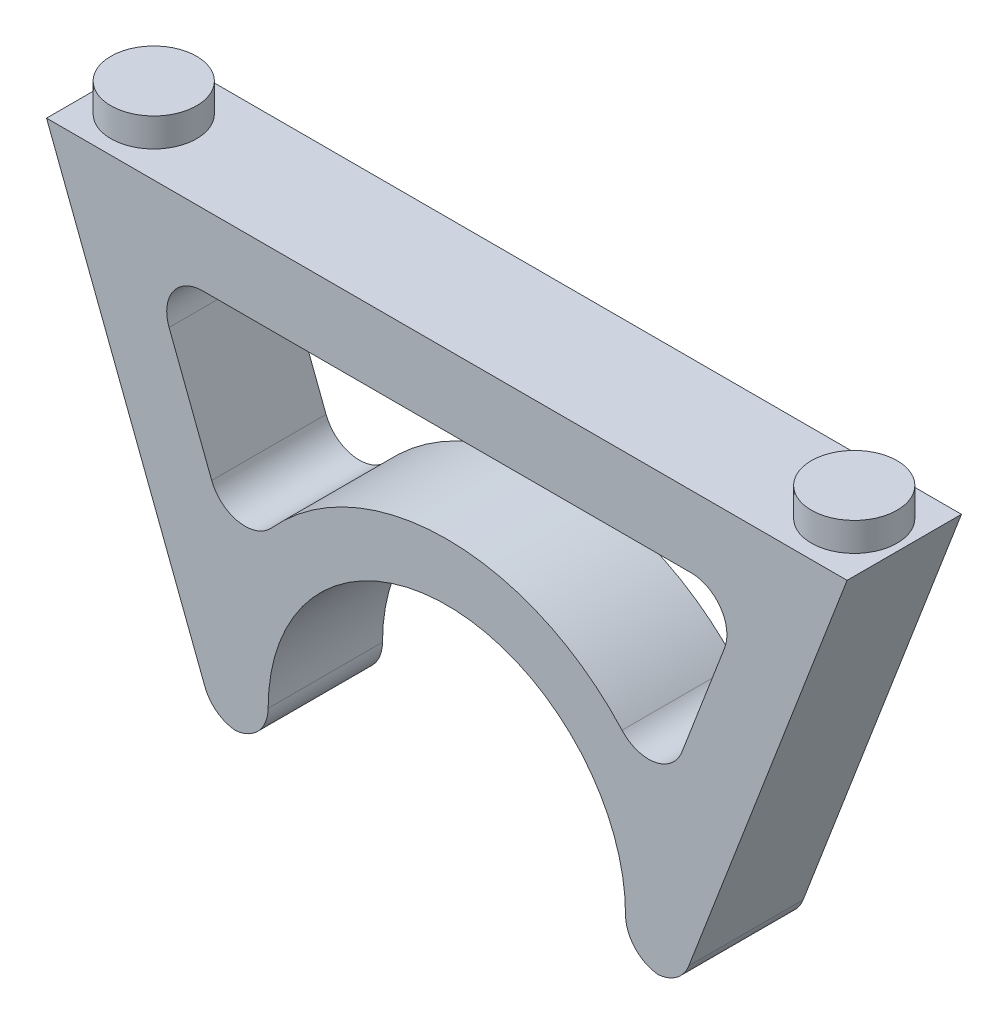
ISO-10303-21;
HEADER;
FILE_DESCRIPTION(('STEP AP214'),'2;1');
FILE_NAME('part.step','',(''),(''),'','','');
FILE_SCHEMA(('AUTOMOTIVE_DESIGN { 1 0 10303 214 1 1 1 1 }'));
ENDSEC;
DATA;
#1=APPLICATION_CONTEXT('core data for automotive mechanical design processes');
#2=APPLICATION_PROTOCOL_DEFINITION('international standard','automotive_design',2000,#1);
#3=PRODUCT_CONTEXT('',#1,'mechanical');
#4=PRODUCT('Part','Part','',(#3));
#5=PRODUCT_RELATED_PRODUCT_CATEGORY('part','',(#4));
#6=PRODUCT_DEFINITION_FORMATION('','',#4);
#7=PRODUCT_DEFINITION_CONTEXT('part definition',#1,'design');
#8=PRODUCT_DEFINITION('design','',#6,#7);
#9=PRODUCT_DEFINITION_SHAPE('','',#8);
#10=(LENGTH_UNIT() NAMED_UNIT(*) SI_UNIT(.MILLI.,.METRE.));
#11=(NAMED_UNIT(*) PLANE_ANGLE_UNIT() SI_UNIT($,.RADIAN.));
#12=(NAMED_UNIT(*) SI_UNIT($,.STERADIAN.) SOLID_ANGLE_UNIT());
#13=UNCERTAINTY_MEASURE_WITH_UNIT(LENGTH_MEASURE(1.E-05),#10,'distance_accuracy_value','');
#14=(GEOMETRIC_REPRESENTATION_CONTEXT(3) GLOBAL_UNCERTAINTY_ASSIGNED_CONTEXT((#13)) GLOBAL_UNIT_ASSIGNED_CONTEXT((#10,
#11,#12)) REPRESENTATION_CONTEXT('',''));
#15=CARTESIAN_POINT('',(0.,0.,0.));
#16=DIRECTION('',(0.,0.,1.));
#17=DIRECTION('',(1.,0.,0.));
#18=AXIS2_PLACEMENT_3D('',#15,#16,#17);
#19=CARTESIAN_POINT('',(28.,0.,8.));
#20=DIRECTION('',(-0.933758120132478,0.357904698329961,0.));
#21=DIRECTION('',(-0.357904698329961,-0.933758120132478,0.));
#22=AXIS2_PLACEMENT_3D('',#19,#20,#21);
#23=PLANE('',#22);
#24=DIRECTION('',(0.357904698329961,0.933758120132478,0.));
#25=VECTOR('',#24,1.);
#26=CARTESIAN_POINT('',(28.,0.,8.));
#27=LINE('',#26,#25);
#28=CARTESIAN_POINT('',(16.9247860200794,-28.8947617458249,8.));
#29=VERTEX_POINT('',#28);
#30=CARTESIAN_POINT('',(28.,0.,8.));
#31=VERTEX_POINT('',#30);
#32=EDGE_CURVE('E155',#29,#31,#27,.T.);
#33=ORIENTED_EDGE('',*,*,#32,.F.);
#34=DIRECTION('',(0.,0.,-1.));
#35=VECTOR('',#34,1.);
#36=CARTESIAN_POINT('',(16.9247860200794,-28.8947617458249,8.));
#37=LINE('',#36,#35);
#38=CARTESIAN_POINT('',(16.9247860200794,-28.8947617458249,0.));
#39=VERTEX_POINT('',#38);
#40=EDGE_CURVE('E200',#29,#39,#37,.T.);
#41=ORIENTED_EDGE('',*,*,#40,.T.);
#42=DIRECTION('',(0.357904698329961,0.933758120132478,0.));
#43=VECTOR('',#42,1.);
#44=CARTESIAN_POINT('',(28.,0.,0.));
#45=LINE('',#44,#43);
#46=CARTESIAN_POINT('',(28.,0.,0.));
#47=VERTEX_POINT('',#46);
#48=EDGE_CURVE('E172',#39,#47,#45,.T.);
#49=ORIENTED_EDGE('',*,*,#48,.T.);
#50=DIRECTION('',(0.,0.,-1.));
#51=VECTOR('',#50,1.);
#52=CARTESIAN_POINT('',(28.,0.,8.));
#53=LINE('',#52,#51);
#54=EDGE_CURVE('E167',#31,#47,#53,.T.);
#55=ORIENTED_EDGE('',*,*,#54,.F.);
#56=EDGE_LOOP('',(#33,#41,#49,#55));
#57=FACE_BOUND('',#56,.T.);
#58=ADVANCED_FACE('F39',(#57),#23,.F.);
#59=CARTESIAN_POINT('',(-28.,0.,8.));
#60=DIRECTION('',(0.,-1.,0.));
#61=DIRECTION('',(1.,0.,0.));
#62=AXIS2_PLACEMENT_3D('',#59,#60,#61);
#63=PLANE('',#62);
#64=CARTESIAN_POINT('',(-24.5,0.,4.));
#65=DIRECTION('',(0.,1.,0.));
#66=DIRECTION('',(-1.,0.,0.));
#67=AXIS2_PLACEMENT_3D('',#64,#65,#66);
#68=CIRCLE('',#67,3.);
#69=CARTESIAN_POINT('',(-27.5,0.,4.));
#70=VERTEX_POINT('',#69);
#71=EDGE_CURVE('E11',#70,#70,#68,.T.);
#72=ORIENTED_EDGE('',*,*,#71,.F.);
#73=EDGE_LOOP('',(#72));
#74=FACE_BOUND('',#73,.T.);
#75=CARTESIAN_POINT('',(24.5,0.,4.));
#76=DIRECTION('',(0.,1.,0.));
#77=DIRECTION('',(-1.,0.,0.));
#78=AXIS2_PLACEMENT_3D('',#75,#76,#77);
#79=CIRCLE('',#78,3.);
#80=CARTESIAN_POINT('',(21.5,0.,4.));
#81=VERTEX_POINT('',#80);
#82=EDGE_CURVE('E48',#81,#81,#79,.T.);
#83=ORIENTED_EDGE('',*,*,#82,.F.);
#84=EDGE_LOOP('',(#83));
#85=FACE_BOUND('',#84,.T.);
#86=DIRECTION('',(-1.,0.,0.));
#87=VECTOR('',#86,1.);
#88=CARTESIAN_POINT('',(-28.,0.,0.));
#89=LINE('',#88,#87);
#90=CARTESIAN_POINT('',(-28.,0.,0.));
#91=VERTEX_POINT('',#90);
#92=EDGE_CURVE('E285',#47,#91,#89,.T.);
#93=ORIENTED_EDGE('',*,*,#92,.T.);
#94=DIRECTION('',(0.,0.,-1.));
#95=VECTOR('',#94,1.);
#96=CARTESIAN_POINT('',(-28.,0.,8.));
#97=LINE('',#96,#95);
#98=CARTESIAN_POINT('',(-28.,0.,8.));
#99=VERTEX_POINT('',#98);
#100=EDGE_CURVE('E169',#99,#91,#97,.T.);
#101=ORIENTED_EDGE('',*,*,#100,.F.);
#102=DIRECTION('',(-1.,0.,0.));
#103=VECTOR('',#102,1.);
#104=CARTESIAN_POINT('',(-28.,0.,8.));
#105=LINE('',#104,#103);
#106=EDGE_CURVE('E154',#31,#99,#105,.T.);
#107=ORIENTED_EDGE('',*,*,#106,.F.);
#108=ORIENTED_EDGE('',*,*,#54,.T.);
#109=EDGE_LOOP('',(#93,#101,#107,#108));
#110=FACE_BOUND('',#109,.T.);
#111=ADVANCED_FACE('F164',(#74,#85,#110),#63,.F.);
#112=CARTESIAN_POINT('',(-28.,0.,8.));
#113=DIRECTION('',(0.933758120132478,0.357904698329961,0.));
#114=DIRECTION('',(-0.357904698329961,0.933758120132478,0.));
#115=AXIS2_PLACEMENT_3D('',#112,#113,#114);
#116=PLANE('',#115);
#117=DIRECTION('',(0.357904698329961,-0.933758120132478,0.));
#118=VECTOR('',#117,1.);
#119=CARTESIAN_POINT('',(-28.,0.,0.));
#120=LINE('',#119,#118);
#121=CARTESIAN_POINT('',(-16.9247860200794,-28.8947617458249,0.));
#122=VERTEX_POINT('',#121);
#123=EDGE_CURVE('E286',#91,#122,#120,.T.);
#124=ORIENTED_EDGE('',*,*,#123,.T.);
#125=DIRECTION('',(0.,0.,-1.));
#126=VECTOR('',#125,1.);
#127=CARTESIAN_POINT('',(-16.9247860200794,-28.8947617458249,8.));
#128=LINE('',#127,#126);
#129=CARTESIAN_POINT('',(-16.9247860200794,-28.8947617458249,8.));
#130=VERTEX_POINT('',#129);
#131=EDGE_CURVE('E203',#122,#130,#128,.F.);
#132=ORIENTED_EDGE('',*,*,#131,.T.);
#133=DIRECTION('',(0.357904698329961,-0.933758120132478,0.));
#134=VECTOR('',#133,1.);
#135=CARTESIAN_POINT('',(-28.,0.,8.));
#136=LINE('',#135,#134);
#137=EDGE_CURVE('E168',#99,#130,#136,.T.);
#138=ORIENTED_EDGE('',*,*,#137,.F.);
#139=ORIENTED_EDGE('',*,*,#100,.T.);
#140=EDGE_LOOP('',(#124,#132,#138,#139));
#141=FACE_BOUND('',#140,.T.);
#142=ADVANCED_FACE('F319',(#141),#116,.F.);
#143=CARTESIAN_POINT('',(0.,-28.,8.));
#144=DIRECTION('',(0.,0.,-1.));
#145=DIRECTION('',(-1.,0.,0.));
#146=AXIS2_PLACEMENT_3D('',#143,#144,#145);
#147=CYLINDRICAL_SURFACE('',#146,12.5);
#148=CARTESIAN_POINT('',(0.,-28.,0.));
#149=DIRECTION('',(0.,0.,-1.));
#150=DIRECTION('',(-1.,0.,0.));
#151=AXIS2_PLACEMENT_3D('',#148,#149,#150);
#152=CIRCLE('',#151,12.5);
#153=CARTESIAN_POINT('',(-12.5,-28.,0.));
#154=VERTEX_POINT('',#153);
#155=CARTESIAN_POINT('',(12.5,-28.,0.));
#156=VERTEX_POINT('',#155);
#157=EDGE_CURVE('E161',#154,#156,#152,.T.);
#158=ORIENTED_EDGE('',*,*,#157,.T.);
#159=DIRECTION('',(0.,0.,-1.));
#160=VECTOR('',#159,1.);
#161=CARTESIAN_POINT('',(12.5,-28.,8.));
#162=LINE('',#161,#160);
#163=CARTESIAN_POINT('',(12.5,-28.,8.));
#164=VERTEX_POINT('',#163);
#165=EDGE_CURVE('E191',#156,#164,#162,.F.);
#166=ORIENTED_EDGE('',*,*,#165,.T.);
#167=CARTESIAN_POINT('',(0.,-28.,8.));
#168=DIRECTION('',(0.,0.,-1.));
#169=DIRECTION('',(-1.,0.,0.));
#170=AXIS2_PLACEMENT_3D('',#167,#168,#169);
#171=CIRCLE('',#170,12.5);
#172=CARTESIAN_POINT('',(-12.5,-28.,8.));
#173=VERTEX_POINT('',#172);
#174=EDGE_CURVE('E178',#173,#164,#171,.T.);
#175=ORIENTED_EDGE('',*,*,#174,.F.);
#176=DIRECTION('',(0.,0.,-1.));
#177=VECTOR('',#176,1.);
#178=CARTESIAN_POINT('',(-12.5,-28.,8.));
#179=LINE('',#178,#177);
#180=EDGE_CURVE('E187',#173,#154,#179,.T.);
#181=ORIENTED_EDGE('',*,*,#180,.T.);
#182=EDGE_LOOP('',(#158,#166,#175,#181));
#183=FACE_BOUND('',#182,.T.);
#184=ADVANCED_FACE('F295',(#183),#147,.F.);
#185=CARTESIAN_POINT('',(0.,-28.,8.));
#186=DIRECTION('',(0.,0.,-1.));
#187=DIRECTION('',(-1.,0.,0.));
#188=AXIS2_PLACEMENT_3D('',#185,#186,#187);
#189=PLANE('',#188);
#190=DIRECTION('',(0.357904698329961,-0.933758120132478,0.));
#191=VECTOR('',#190,1.);
#192=CARTESIAN_POINT('',(-20.7288198675193,-4.99999999999999,8.));
#193=LINE('',#192,#191);
#194=CARTESIAN_POINT('',(-19.4276251016101,-8.39476174582489,8.));
#195=VERTEX_POINT('',#194);
#196=CARTESIAN_POINT('',(-16.4463918011143,-16.1726725006621,8.));
#197=VERTEX_POINT('',#196);
#198=EDGE_CURVE('E241',#195,#197,#193,.T.);
#199=ORIENTED_EDGE('',*,*,#198,.F.);
#200=CARTESIAN_POINT('',(-17.093229801279,-7.49999999999999,8.));
#201=DIRECTION('',(0.,0.,-1.));
#202=DIRECTION('',(-1.,0.,0.));
#203=AXIS2_PLACEMENT_3D('',#200,#201,#202);
#204=CIRCLE('',#203,2.5);
#205=CARTESIAN_POINT('',(-17.093229801279,-4.99999999999999,8.));
#206=VERTEX_POINT('',#205);
#207=EDGE_CURVE('E231',#195,#206,#204,.T.);
#208=ORIENTED_EDGE('',*,*,#207,.T.);
#209=DIRECTION('',(-1.,0.,0.));
#210=VECTOR('',#209,1.);
#211=CARTESIAN_POINT('',(-20.7288198675193,-4.99999999999999,8.));
#212=LINE('',#211,#210);
#213=CARTESIAN_POINT('',(17.093229801279,-4.99999999999999,8.));
#214=VERTEX_POINT('',#213);
#215=EDGE_CURVE('E238',#214,#206,#212,.T.);
#216=ORIENTED_EDGE('',*,*,#215,.F.);
#217=CARTESIAN_POINT('',(17.093229801279,-7.49999999999999,8.));
#218=DIRECTION('',(0.,0.,-1.));
#219=DIRECTION('',(-1.,0.,0.));
#220=AXIS2_PLACEMENT_3D('',#217,#218,#219);
#221=CIRCLE('',#220,2.5);
#222=CARTESIAN_POINT('',(19.4276251016101,-8.39476174582489,8.));
#223=VERTEX_POINT('',#222);
#224=EDGE_CURVE('E229',#214,#223,#221,.T.);
#225=ORIENTED_EDGE('',*,*,#224,.T.);
#226=DIRECTION('',(0.357904698329961,0.933758120132478,0.));
#227=VECTOR('',#226,1.);
#228=CARTESIAN_POINT('',(20.7288198675193,-4.99999999999999,8.));
#229=LINE('',#228,#227);
#230=CARTESIAN_POINT('',(16.4463918011143,-16.1726725006621,8.));
#231=VERTEX_POINT('',#230);
#232=EDGE_CURVE('E264',#231,#223,#229,.T.);
#233=ORIENTED_EDGE('',*,*,#232,.F.);
#234=CARTESIAN_POINT('',(14.1119965007831,-15.2779107548372,8.));
#235=DIRECTION('',(0.,0.,-1.));
#236=DIRECTION('',(-1.,0.,0.));
#237=AXIS2_PLACEMENT_3D('',#234,#235,#236);
#238=CIRCLE('',#237,2.5);
#239=CARTESIAN_POINT('',(12.2551548559432,-16.9518698660428,8.));
#240=VERTEX_POINT('',#239);
#241=EDGE_CURVE('E224',#231,#240,#238,.T.);
#242=ORIENTED_EDGE('',*,*,#241,.T.);
#243=CARTESIAN_POINT('',(0.,-28.,8.));
#244=DIRECTION('',(0.,0.,-1.));
#245=DIRECTION('',(-1.,0.,0.));
#246=AXIS2_PLACEMENT_3D('',#243,#244,#245);
#247=CIRCLE('',#246,16.5);
#248=CARTESIAN_POINT('',(-12.2551548559432,-16.9518698660428,8.));
#249=VERTEX_POINT('',#248);
#250=EDGE_CURVE('E277',#249,#240,#247,.T.);
#251=ORIENTED_EDGE('',*,*,#250,.F.);
#252=CARTESIAN_POINT('',(-14.1119965007831,-15.2779107548372,8.));
#253=DIRECTION('',(0.,0.,-1.));
#254=DIRECTION('',(-1.,0.,0.));
#255=AXIS2_PLACEMENT_3D('',#252,#253,#254);
#256=CIRCLE('',#255,2.5);
#257=EDGE_CURVE('E234',#249,#197,#256,.T.);
#258=ORIENTED_EDGE('',*,*,#257,.T.);
#259=EDGE_LOOP('',(#199,#208,#216,#225,#233,#242,#251,#258));
#260=FACE_BOUND('',#259,.T.);
#261=ORIENTED_EDGE('',*,*,#174,.T.);
#262=CARTESIAN_POINT('',(15.,-28.,8.));
#263=DIRECTION('',(0.,0.,-1.));
#264=DIRECTION('',(-1.,0.,0.));
#265=AXIS2_PLACEMENT_3D('',#262,#263,#264);
#266=CIRCLE('',#265,2.5);
#267=CARTESIAN_POINT('',(14.7951953598741,-30.4915968894231,8.));
#268=VERTEX_POINT('',#267);
#269=EDGE_CURVE('E57',#164,#268,#266,.F.);
#270=ORIENTED_EDGE('',*,*,#269,.T.);
#271=CARTESIAN_POINT('',(14.5903907197482,-28.,8.));
#272=DIRECTION('',(0.,0.,-1.));
#273=DIRECTION('',(-1.,0.,0.));
#274=AXIS2_PLACEMENT_3D('',#271,#272,#273);
#275=CIRCLE('',#274,2.5);
#276=EDGE_CURVE('E160',#268,#29,#275,.F.);
#277=ORIENTED_EDGE('',*,*,#276,.T.);
#278=ORIENTED_EDGE('',*,*,#32,.T.);
#279=ORIENTED_EDGE('',*,*,#106,.T.);
#280=ORIENTED_EDGE('',*,*,#137,.T.);
#281=CARTESIAN_POINT('',(-14.5903907197482,-28.,8.));
#282=DIRECTION('',(0.,0.,-1.));
#283=DIRECTION('',(-1.,0.,0.));
#284=AXIS2_PLACEMENT_3D('',#281,#282,#283);
#285=CIRCLE('',#284,2.5);
#286=CARTESIAN_POINT('',(-14.7951953598741,-30.4915968894231,8.));
#287=VERTEX_POINT('',#286);
#288=EDGE_CURVE('E62',#130,#287,#285,.F.);
#289=ORIENTED_EDGE('',*,*,#288,.T.);
#290=CARTESIAN_POINT('',(-15.,-28.,8.));
#291=DIRECTION('',(0.,0.,-1.));
#292=DIRECTION('',(-1.,0.,0.));
#293=AXIS2_PLACEMENT_3D('',#290,#291,#292);
#294=CIRCLE('',#293,2.5);
#295=EDGE_CURVE('E194',#287,#173,#294,.F.);
#296=ORIENTED_EDGE('',*,*,#295,.T.);
#297=EDGE_LOOP('',(#261,#270,#277,#278,#279,#280,#289,#296));
#298=FACE_BOUND('',#297,.T.);
#299=ADVANCED_FACE('F152',(#260,#298),#189,.F.);
#300=CARTESIAN_POINT('',(0.,-28.,0.));
#301=DIRECTION('',(0.,0.,-1.));
#302=DIRECTION('',(-1.,0.,0.));
#303=AXIS2_PLACEMENT_3D('',#300,#301,#302);
#304=PLANE('',#303);
#305=DIRECTION('',(0.357904698329961,0.933758120132478,0.));
#306=VECTOR('',#305,1.);
#307=CARTESIAN_POINT('',(20.7288198675193,-4.99999999999999,0.));
#308=LINE('',#307,#306);
#309=CARTESIAN_POINT('',(16.4463918011143,-16.1726725006621,0.));
#310=VERTEX_POINT('',#309);
#311=CARTESIAN_POINT('',(19.4276251016101,-8.39476174582489,0.));
#312=VERTEX_POINT('',#311);
#313=EDGE_CURVE('E271',#310,#312,#308,.T.);
#314=ORIENTED_EDGE('',*,*,#313,.T.);
#315=CARTESIAN_POINT('',(17.093229801279,-7.49999999999999,0.));
#316=DIRECTION('',(0.,0.,-1.));
#317=DIRECTION('',(-1.,0.,0.));
#318=AXIS2_PLACEMENT_3D('',#315,#316,#317);
#319=CIRCLE('',#318,2.5);
#320=CARTESIAN_POINT('',(17.093229801279,-4.99999999999999,0.));
#321=VERTEX_POINT('',#320);
#322=EDGE_CURVE('E230',#312,#321,#319,.F.);
#323=ORIENTED_EDGE('',*,*,#322,.T.);
#324=DIRECTION('',(-1.,0.,0.));
#325=VECTOR('',#324,1.);
#326=CARTESIAN_POINT('',(-20.7288198675193,-4.99999999999999,0.));
#327=LINE('',#326,#325);
#328=CARTESIAN_POINT('',(-17.093229801279,-4.99999999999999,0.));
#329=VERTEX_POINT('',#328);
#330=EDGE_CURVE('E261',#321,#329,#327,.T.);
#331=ORIENTED_EDGE('',*,*,#330,.T.);
#332=CARTESIAN_POINT('',(-17.093229801279,-7.49999999999999,0.));
#333=DIRECTION('',(0.,0.,-1.));
#334=DIRECTION('',(-1.,0.,0.));
#335=AXIS2_PLACEMENT_3D('',#332,#333,#334);
#336=CIRCLE('',#335,2.5);
#337=CARTESIAN_POINT('',(-19.4276251016101,-8.39476174582489,0.));
#338=VERTEX_POINT('',#337);
#339=EDGE_CURVE('E232',#329,#338,#336,.F.);
#340=ORIENTED_EDGE('',*,*,#339,.T.);
#341=DIRECTION('',(0.357904698329961,-0.933758120132478,0.));
#342=VECTOR('',#341,1.);
#343=CARTESIAN_POINT('',(-20.7288198675193,-4.99999999999999,0.));
#344=LINE('',#343,#342);
#345=CARTESIAN_POINT('',(-16.4463918011143,-16.1726725006621,0.));
#346=VERTEX_POINT('',#345);
#347=EDGE_CURVE('E262',#338,#346,#344,.T.);
#348=ORIENTED_EDGE('',*,*,#347,.T.);
#349=CARTESIAN_POINT('',(-14.1119965007831,-15.2779107548372,0.));
#350=DIRECTION('',(0.,0.,-1.));
#351=DIRECTION('',(-1.,0.,0.));
#352=AXIS2_PLACEMENT_3D('',#349,#350,#351);
#353=CIRCLE('',#352,2.5);
#354=CARTESIAN_POINT('',(-12.2551548559432,-16.9518698660428,0.));
#355=VERTEX_POINT('',#354);
#356=EDGE_CURVE('E240',#346,#355,#353,.F.);
#357=ORIENTED_EDGE('',*,*,#356,.T.);
#358=CARTESIAN_POINT('',(0.,-28.,0.));
#359=DIRECTION('',(0.,0.,-1.));
#360=DIRECTION('',(-1.,0.,0.));
#361=AXIS2_PLACEMENT_3D('',#358,#359,#360);
#362=CIRCLE('',#361,16.5);
#363=CARTESIAN_POINT('',(12.2551548559432,-16.9518698660428,0.));
#364=VERTEX_POINT('',#363);
#365=EDGE_CURVE('E268',#355,#364,#362,.T.);
#366=ORIENTED_EDGE('',*,*,#365,.T.);
#367=CARTESIAN_POINT('',(14.1119965007831,-15.2779107548372,0.));
#368=DIRECTION('',(0.,0.,-1.));
#369=DIRECTION('',(-1.,0.,0.));
#370=AXIS2_PLACEMENT_3D('',#367,#368,#369);
#371=CIRCLE('',#370,2.5);
#372=EDGE_CURVE('E223',#364,#310,#371,.F.);
#373=ORIENTED_EDGE('',*,*,#372,.T.);
#374=EDGE_LOOP('',(#314,#323,#331,#340,#348,#357,#366,#373));
#375=FACE_BOUND('',#374,.T.);
#376=CARTESIAN_POINT('',(14.5903907197482,-28.,0.));
#377=DIRECTION('',(0.,0.,-1.));
#378=DIRECTION('',(-1.,0.,0.));
#379=AXIS2_PLACEMENT_3D('',#376,#377,#378);
#380=CIRCLE('',#379,2.5);
#381=CARTESIAN_POINT('',(14.7951953598741,-30.4915968894231,0.));
#382=VERTEX_POINT('',#381);
#383=EDGE_CURVE('E184',#39,#382,#380,.T.);
#384=ORIENTED_EDGE('',*,*,#383,.T.);
#385=CARTESIAN_POINT('',(15.,-28.,0.));
#386=DIRECTION('',(0.,0.,-1.));
#387=DIRECTION('',(-1.,0.,0.));
#388=AXIS2_PLACEMENT_3D('',#385,#386,#387);
#389=CIRCLE('',#388,2.5);
#390=EDGE_CURVE('E188',#382,#156,#389,.T.);
#391=ORIENTED_EDGE('',*,*,#390,.T.);
#392=ORIENTED_EDGE('',*,*,#157,.F.);
#393=CARTESIAN_POINT('',(-15.,-28.,0.));
#394=DIRECTION('',(0.,0.,-1.));
#395=DIRECTION('',(-1.,0.,0.));
#396=AXIS2_PLACEMENT_3D('',#393,#394,#395);
#397=CIRCLE('',#396,2.5);
#398=CARTESIAN_POINT('',(-14.7951953598741,-30.4915968894231,0.));
#399=VERTEX_POINT('',#398);
#400=EDGE_CURVE('E180',#154,#399,#397,.T.);
#401=ORIENTED_EDGE('',*,*,#400,.T.);
#402=CARTESIAN_POINT('',(-14.5903907197482,-28.,0.));
#403=DIRECTION('',(0.,0.,-1.));
#404=DIRECTION('',(-1.,0.,0.));
#405=AXIS2_PLACEMENT_3D('',#402,#403,#404);
#406=CIRCLE('',#405,2.5);
#407=EDGE_CURVE('E171',#399,#122,#406,.T.);
#408=ORIENTED_EDGE('',*,*,#407,.T.);
#409=ORIENTED_EDGE('',*,*,#123,.F.);
#410=ORIENTED_EDGE('',*,*,#92,.F.);
#411=ORIENTED_EDGE('',*,*,#48,.F.);
#412=EDGE_LOOP('',(#384,#391,#392,#401,#408,#409,#410,#411));
#413=FACE_BOUND('',#412,.T.);
#414=ADVANCED_FACE('F299',(#375,#413),#304,.T.);
#415=CARTESIAN_POINT('',(-20.7288198675193,-4.99999999999999,0.));
#416=DIRECTION('',(0.,1.,0.));
#417=DIRECTION('',(0.,0.,1.));
#418=AXIS2_PLACEMENT_3D('',#415,#416,#417);
#419=PLANE('',#418);
#420=ORIENTED_EDGE('',*,*,#330,.F.);
#421=DIRECTION('',(0.,0.,1.));
#422=VECTOR('',#421,1.);
#423=CARTESIAN_POINT('',(17.093229801279,-4.99999999999999,8.));
#424=LINE('',#423,#422);
#425=EDGE_CURVE('E214',#321,#214,#424,.T.);
#426=ORIENTED_EDGE('',*,*,#425,.T.);
#427=ORIENTED_EDGE('',*,*,#215,.T.);
#428=DIRECTION('',(0.,0.,1.));
#429=VECTOR('',#428,1.);
#430=CARTESIAN_POINT('',(-17.093229801279,-4.99999999999999,0.));
#431=LINE('',#430,#429);
#432=EDGE_CURVE('E213',#206,#329,#431,.F.);
#433=ORIENTED_EDGE('',*,*,#432,.T.);
#434=EDGE_LOOP('',(#420,#426,#427,#433));
#435=FACE_BOUND('',#434,.T.);
#436=ADVANCED_FACE('F329',(#435),#419,.F.);
#437=CARTESIAN_POINT('',(20.7288198675193,-4.99999999999999,0.));
#438=DIRECTION('',(0.933758120132478,-0.357904698329961,0.));
#439=DIRECTION('',(0.357904698329961,0.933758120132478,0.));
#440=AXIS2_PLACEMENT_3D('',#437,#438,#439);
#441=PLANE('',#440);
#442=ORIENTED_EDGE('',*,*,#313,.F.);
#443=DIRECTION('',(0.,0.,-1.));
#444=VECTOR('',#443,1.);
#445=CARTESIAN_POINT('',(16.4463918011143,-16.1726725006621,8.));
#446=LINE('',#445,#444);
#447=EDGE_CURVE('E202',#310,#231,#446,.F.);
#448=ORIENTED_EDGE('',*,*,#447,.T.);
#449=ORIENTED_EDGE('',*,*,#232,.T.);
#450=DIRECTION('',(0.,0.,1.));
#451=VECTOR('',#450,1.);
#452=CARTESIAN_POINT('',(19.4276251016101,-8.39476174582489,0.));
#453=LINE('',#452,#451);
#454=EDGE_CURVE('E201',#223,#312,#453,.F.);
#455=ORIENTED_EDGE('',*,*,#454,.T.);
#456=EDGE_LOOP('',(#442,#448,#449,#455));
#457=FACE_BOUND('',#456,.T.);
#458=ADVANCED_FACE('F338',(#457),#441,.F.);
#459=CARTESIAN_POINT('',(0.,-28.,0.));
#460=DIRECTION('',(0.,0.,1.));
#461=DIRECTION('',(1.,0.,0.));
#462=AXIS2_PLACEMENT_3D('',#459,#460,#461);
#463=CYLINDRICAL_SURFACE('',#462,16.5);
#464=ORIENTED_EDGE('',*,*,#250,.T.);
#465=DIRECTION('',(0.,0.,1.));
#466=VECTOR('',#465,1.);
#467=CARTESIAN_POINT('',(12.2551548559432,-16.9518698660428,0.));
#468=LINE('',#467,#466);
#469=EDGE_CURVE('E211',#240,#364,#468,.F.);
#470=ORIENTED_EDGE('',*,*,#469,.T.);
#471=ORIENTED_EDGE('',*,*,#365,.F.);
#472=DIRECTION('',(0.,0.,1.));
#473=VECTOR('',#472,1.);
#474=CARTESIAN_POINT('',(-12.2551548559432,-16.9518698660428,0.));
#475=LINE('',#474,#473);
#476=EDGE_CURVE('E208',#355,#249,#475,.T.);
#477=ORIENTED_EDGE('',*,*,#476,.T.);
#478=EDGE_LOOP('',(#464,#470,#471,#477));
#479=FACE_BOUND('',#478,.T.);
#480=ADVANCED_FACE('F309',(#479),#463,.T.);
#481=CARTESIAN_POINT('',(-20.7288198675193,-4.99999999999999,0.));
#482=DIRECTION('',(-0.933758120132478,-0.357904698329961,0.));
#483=DIRECTION('',(0.357904698329961,-0.933758120132478,0.));
#484=AXIS2_PLACEMENT_3D('',#481,#482,#483);
#485=PLANE('',#484);
#486=ORIENTED_EDGE('',*,*,#347,.F.);
#487=DIRECTION('',(0.,0.,1.));
#488=VECTOR('',#487,1.);
#489=CARTESIAN_POINT('',(-19.4276251016101,-8.39476174582489,8.));
#490=LINE('',#489,#488);
#491=EDGE_CURVE('E219',#338,#195,#490,.T.);
#492=ORIENTED_EDGE('',*,*,#491,.T.);
#493=ORIENTED_EDGE('',*,*,#198,.T.);
#494=DIRECTION('',(0.,0.,-1.));
#495=VECTOR('',#494,1.);
#496=CARTESIAN_POINT('',(-16.4463918011143,-16.1726725006621,0.));
#497=LINE('',#496,#495);
#498=EDGE_CURVE('E217',#197,#346,#497,.T.);
#499=ORIENTED_EDGE('',*,*,#498,.T.);
#500=EDGE_LOOP('',(#486,#492,#493,#499));
#501=FACE_BOUND('',#500,.T.);
#502=ADVANCED_FACE('F305',(#501),#485,.F.);
#503=CARTESIAN_POINT('',(14.5903907197482,-28.,8.));
#504=DIRECTION('',(0.,0.,-1.));
#505=DIRECTION('',(-1.,0.,0.));
#506=AXIS2_PLACEMENT_3D('',#503,#504,#505);
#507=CYLINDRICAL_SURFACE('',#506,2.5);
#508=ORIENTED_EDGE('',*,*,#40,.F.);
#509=ORIENTED_EDGE('',*,*,#276,.F.);
#510=DIRECTION('',(0.,0.,-1.));
#511=VECTOR('',#510,1.);
#512=CARTESIAN_POINT('',(14.7951953598741,-30.4915968894231,4.));
#513=LINE('',#512,#511);
#514=EDGE_CURVE('E236',#382,#268,#513,.F.);
#515=ORIENTED_EDGE('',*,*,#514,.F.);
#516=ORIENTED_EDGE('',*,*,#383,.F.);
#517=EDGE_LOOP('',(#508,#509,#515,#516));
#518=FACE_BOUND('',#517,.T.);
#519=ADVANCED_FACE('F296',(#518),#507,.T.);
#520=CARTESIAN_POINT('',(15.,-28.,8.));
#521=DIRECTION('',(0.,0.,-1.));
#522=DIRECTION('',(-1.,0.,0.));
#523=AXIS2_PLACEMENT_3D('',#520,#521,#522);
#524=CYLINDRICAL_SURFACE('',#523,2.5);
#525=ORIENTED_EDGE('',*,*,#269,.F.);
#526=ORIENTED_EDGE('',*,*,#165,.F.);
#527=ORIENTED_EDGE('',*,*,#390,.F.);
#528=ORIENTED_EDGE('',*,*,#514,.T.);
#529=EDGE_LOOP('',(#525,#526,#527,#528));
#530=FACE_BOUND('',#529,.T.);
#531=ADVANCED_FACE('F298',(#530),#524,.T.);
#532=CARTESIAN_POINT('',(-14.5903907197482,-28.,8.));
#533=DIRECTION('',(0.,0.,-1.));
#534=DIRECTION('',(-1.,0.,0.));
#535=AXIS2_PLACEMENT_3D('',#532,#533,#534);
#536=CYLINDRICAL_SURFACE('',#535,2.5);
#537=DIRECTION('',(0.,0.,-1.));
#538=VECTOR('',#537,1.);
#539=CARTESIAN_POINT('',(-14.7951953598741,-30.4915968894231,4.));
#540=LINE('',#539,#538);
#541=EDGE_CURVE('E43',#287,#399,#540,.T.);
#542=ORIENTED_EDGE('',*,*,#541,.F.);
#543=ORIENTED_EDGE('',*,*,#288,.F.);
#544=ORIENTED_EDGE('',*,*,#131,.F.);
#545=ORIENTED_EDGE('',*,*,#407,.F.);
#546=EDGE_LOOP('',(#542,#543,#544,#545));
#547=FACE_BOUND('',#546,.T.);
#548=ADVANCED_FACE('F306',(#547),#536,.T.);
#549=CARTESIAN_POINT('',(-15.,-28.,8.));
#550=DIRECTION('',(0.,0.,-1.));
#551=DIRECTION('',(-1.,0.,0.));
#552=AXIS2_PLACEMENT_3D('',#549,#550,#551);
#553=CYLINDRICAL_SURFACE('',#552,2.5);
#554=ORIENTED_EDGE('',*,*,#295,.F.);
#555=ORIENTED_EDGE('',*,*,#541,.T.);
#556=ORIENTED_EDGE('',*,*,#400,.F.);
#557=ORIENTED_EDGE('',*,*,#180,.F.);
#558=EDGE_LOOP('',(#554,#555,#556,#557));
#559=FACE_BOUND('',#558,.T.);
#560=ADVANCED_FACE('F413',(#559),#553,.T.);
#561=CARTESIAN_POINT('',(14.1119965007831,-15.2779107548372,0.));
#562=DIRECTION('',(0.,0.,1.));
#563=DIRECTION('',(1.,0.,0.));
#564=AXIS2_PLACEMENT_3D('',#561,#562,#563);
#565=CYLINDRICAL_SURFACE('',#564,2.5);
#566=ORIENTED_EDGE('',*,*,#372,.F.);
#567=ORIENTED_EDGE('',*,*,#469,.F.);
#568=ORIENTED_EDGE('',*,*,#241,.F.);
#569=ORIENTED_EDGE('',*,*,#447,.F.);
#570=EDGE_LOOP('',(#566,#567,#568,#569));
#571=FACE_BOUND('',#570,.T.);
#572=ADVANCED_FACE('F403',(#571),#565,.F.);
#573=CARTESIAN_POINT('',(17.093229801279,-7.49999999999999,0.));
#574=DIRECTION('',(0.,0.,-1.));
#575=DIRECTION('',(-1.,0.,0.));
#576=AXIS2_PLACEMENT_3D('',#573,#574,#575);
#577=CYLINDRICAL_SURFACE('',#576,2.5);
#578=ORIENTED_EDGE('',*,*,#322,.F.);
#579=ORIENTED_EDGE('',*,*,#454,.F.);
#580=ORIENTED_EDGE('',*,*,#224,.F.);
#581=ORIENTED_EDGE('',*,*,#425,.F.);
#582=EDGE_LOOP('',(#578,#579,#580,#581));
#583=FACE_BOUND('',#582,.T.);
#584=ADVANCED_FACE('F400',(#583),#577,.F.);
#585=CARTESIAN_POINT('',(-17.093229801279,-7.49999999999999,0.));
#586=DIRECTION('',(0.,0.,-1.));
#587=DIRECTION('',(-1.,0.,0.));
#588=AXIS2_PLACEMENT_3D('',#585,#586,#587);
#589=CYLINDRICAL_SURFACE('',#588,2.5);
#590=ORIENTED_EDGE('',*,*,#339,.F.);
#591=ORIENTED_EDGE('',*,*,#432,.F.);
#592=ORIENTED_EDGE('',*,*,#207,.F.);
#593=ORIENTED_EDGE('',*,*,#491,.F.);
#594=EDGE_LOOP('',(#590,#591,#592,#593));
#595=FACE_BOUND('',#594,.T.);
#596=ADVANCED_FACE('F386',(#595),#589,.F.);
#597=CARTESIAN_POINT('',(-14.1119965007831,-15.2779107548372,0.));
#598=DIRECTION('',(0.,0.,1.));
#599=DIRECTION('',(1.,0.,0.));
#600=AXIS2_PLACEMENT_3D('',#597,#598,#599);
#601=CYLINDRICAL_SURFACE('',#600,2.5);
#602=ORIENTED_EDGE('',*,*,#356,.F.);
#603=ORIENTED_EDGE('',*,*,#498,.F.);
#604=ORIENTED_EDGE('',*,*,#257,.F.);
#605=ORIENTED_EDGE('',*,*,#476,.F.);
#606=EDGE_LOOP('',(#602,#603,#604,#605));
#607=FACE_BOUND('',#606,.T.);
#608=ADVANCED_FACE('F41',(#607),#601,.F.);
#609=CARTESIAN_POINT('',(24.5,2.,4.));
#610=DIRECTION('',(0.,-1.,0.));
#611=DIRECTION('',(1.,0.,0.));
#612=AXIS2_PLACEMENT_3D('',#609,#610,#611);
#613=CYLINDRICAL_SURFACE('',#612,3.);
#614=CARTESIAN_POINT('',(24.5,2.,4.));
#615=DIRECTION('',(0.,1.,0.));
#616=DIRECTION('',(-1.,0.,0.));
#617=AXIS2_PLACEMENT_3D('',#614,#615,#616);
#618=CIRCLE('',#617,3.);
#619=CARTESIAN_POINT('',(21.5,2.,4.));
#620=VERTEX_POINT('',#619);
#621=EDGE_CURVE('E252',#620,#620,#618,.T.);
#622=ORIENTED_EDGE('',*,*,#621,.F.);
#623=EDGE_LOOP('',(#622));
#624=FACE_BOUND('',#623,.T.);
#625=ORIENTED_EDGE('',*,*,#82,.T.);
#626=EDGE_LOOP('',(#625));
#627=FACE_BOUND('',#626,.T.);
#628=ADVANCED_FACE('F349',(#624,#627),#613,.T.);
#629=CARTESIAN_POINT('',(24.5,2.,4.));
#630=DIRECTION('',(0.,1.,0.));
#631=DIRECTION('',(-1.,0.,0.));
#632=AXIS2_PLACEMENT_3D('',#629,#630,#631);
#633=PLANE('',#632);
#634=ORIENTED_EDGE('',*,*,#621,.T.);
#635=EDGE_LOOP('',(#634));
#636=FACE_BOUND('',#635,.T.);
#637=ADVANCED_FACE('F344',(#636),#633,.T.);
#638=CARTESIAN_POINT('',(-24.5,2.,4.));
#639=DIRECTION('',(0.,-1.,0.));
#640=DIRECTION('',(1.,0.,0.));
#641=AXIS2_PLACEMENT_3D('',#638,#639,#640);
#642=CYLINDRICAL_SURFACE('',#641,3.);
#643=CARTESIAN_POINT('',(-24.5,2.,4.));
#644=DIRECTION('',(0.,1.,0.));
#645=DIRECTION('',(-1.,0.,0.));
#646=AXIS2_PLACEMENT_3D('',#643,#644,#645);
#647=CIRCLE('',#646,3.);
#648=CARTESIAN_POINT('',(-27.5,2.,4.));
#649=VERTEX_POINT('',#648);
#650=EDGE_CURVE('E247',#649,#649,#647,.T.);
#651=ORIENTED_EDGE('',*,*,#650,.F.);
#652=EDGE_LOOP('',(#651));
#653=FACE_BOUND('',#652,.T.);
#654=ORIENTED_EDGE('',*,*,#71,.T.);
#655=EDGE_LOOP('',(#654));
#656=FACE_BOUND('',#655,.T.);
#657=ADVANCED_FACE('F346',(#653,#656),#642,.T.);
#658=CARTESIAN_POINT('',(-24.5,2.,4.));
#659=DIRECTION('',(0.,1.,0.));
#660=DIRECTION('',(-1.,0.,0.));
#661=AXIS2_PLACEMENT_3D('',#658,#659,#660);
#662=PLANE('',#661);
#663=ORIENTED_EDGE('',*,*,#650,.T.);
#664=EDGE_LOOP('',(#663));
#665=FACE_BOUND('',#664,.T.);
#666=ADVANCED_FACE('F356',(#665),#662,.T.);
#667=CLOSED_SHELL('',(#58,#111,#142,#184,#299,#414,#436,#458,#480,#502,#519,#531,#548,#560,#572,
#584,#596,#608,#628,#637,#657,#666));
#668=MANIFOLD_SOLID_BREP('B2',#667);
#669=ADVANCED_BREP_SHAPE_REPRESENTATION('',(#18,#668),#14);
#670=SHAPE_DEFINITION_REPRESENTATION(#9,#669);
ENDSEC;
END-ISO-10303-21;
